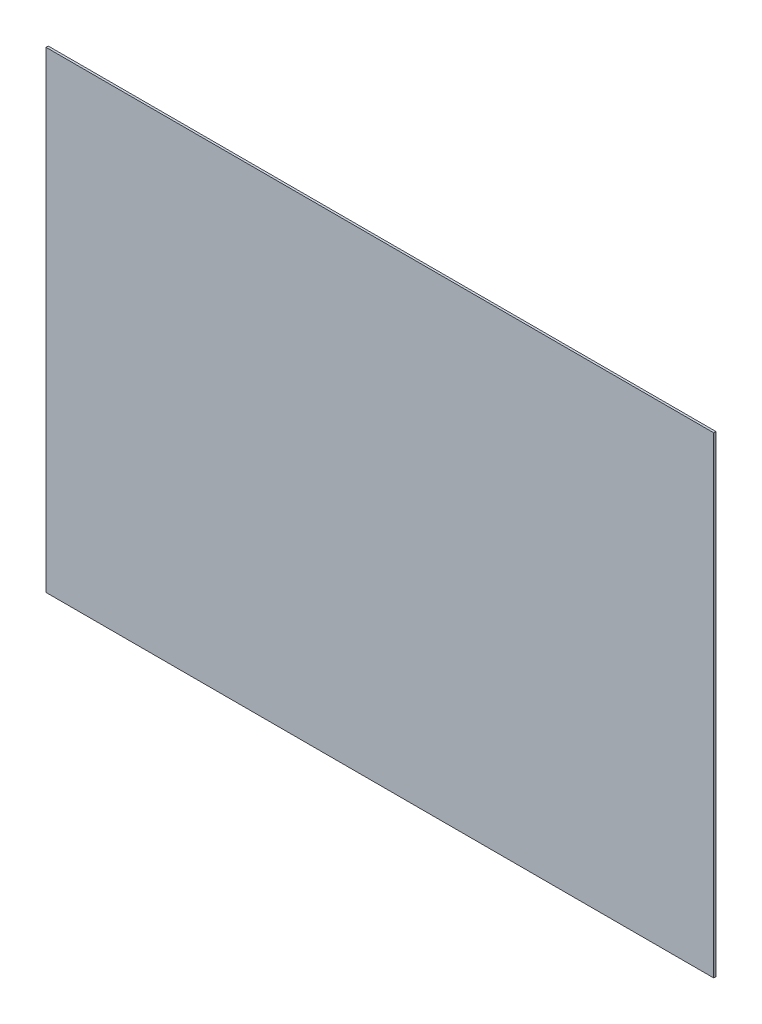
ISO-10303-21;
HEADER;
FILE_DESCRIPTION(('STEP AP214'),'2;1');
FILE_NAME('part.step','',(''),(''),'','','');
FILE_SCHEMA(('AUTOMOTIVE_DESIGN { 1 0 10303 214 1 1 1 1 }'));
ENDSEC;
DATA;
#1=APPLICATION_CONTEXT('core data for automotive mechanical design processes');
#2=APPLICATION_PROTOCOL_DEFINITION('international standard','automotive_design',2000,#1);
#3=PRODUCT_CONTEXT('',#1,'mechanical');
#4=PRODUCT('Part','Part','',(#3));
#5=PRODUCT_RELATED_PRODUCT_CATEGORY('part','',(#4));
#6=PRODUCT_DEFINITION_FORMATION('','',#4);
#7=PRODUCT_DEFINITION_CONTEXT('part definition',#1,'design');
#8=PRODUCT_DEFINITION('design','',#6,#7);
#9=PRODUCT_DEFINITION_SHAPE('','',#8);
#10=(LENGTH_UNIT() NAMED_UNIT(*) SI_UNIT(.MILLI.,.METRE.));
#11=(NAMED_UNIT(*) PLANE_ANGLE_UNIT() SI_UNIT($,.RADIAN.));
#12=(NAMED_UNIT(*) SI_UNIT($,.STERADIAN.) SOLID_ANGLE_UNIT());
#13=UNCERTAINTY_MEASURE_WITH_UNIT(LENGTH_MEASURE(1.E-05),#10,'distance_accuracy_value','');
#14=(GEOMETRIC_REPRESENTATION_CONTEXT(3) GLOBAL_UNCERTAINTY_ASSIGNED_CONTEXT((#13)) GLOBAL_UNIT_ASSIGNED_CONTEXT((#10,
#11,#12)) REPRESENTATION_CONTEXT('',''));
#15=CARTESIAN_POINT('',(0.,0.,0.));
#16=DIRECTION('',(0.,0.,1.));
#17=DIRECTION('',(1.,0.,0.));
#18=AXIS2_PLACEMENT_3D('',#15,#16,#17);
#19=CARTESIAN_POINT('',(-54.0933520941661,28.8189653607095,1.));
#20=DIRECTION('',(1.,0.,0.));
#21=DIRECTION('',(0.,0.,-1.));
#22=AXIS2_PLACEMENT_3D('',#19,#20,#21);
#23=PLANE('',#22);
#24=DIRECTION('',(0.,-1.,0.));
#25=VECTOR('',#24,1.);
#26=CARTESIAN_POINT('',(-54.0933520941661,28.8189653607095,0.));
#27=LINE('',#26,#25);
#28=CARTESIAN_POINT('',(-54.0933520941661,28.8189653607095,0.));
#29=VERTEX_POINT('',#28);
#30=CARTESIAN_POINT('',(-54.0933520941661,-181.18103463929,0.));
#31=VERTEX_POINT('',#30);
#32=EDGE_CURVE('E107',#29,#31,#27,.T.);
#33=ORIENTED_EDGE('',*,*,#32,.T.);
#34=DIRECTION('',(0.,0.,-1.));
#35=VECTOR('',#34,1.);
#36=CARTESIAN_POINT('',(-54.0933520941661,-181.18103463929,1.));
#37=LINE('',#36,#35);
#38=CARTESIAN_POINT('',(-54.0933520941661,-181.18103463929,1.));
#39=VERTEX_POINT('',#38);
#40=EDGE_CURVE('E11',#39,#31,#37,.T.);
#41=ORIENTED_EDGE('',*,*,#40,.F.);
#42=DIRECTION('',(0.,-1.,0.));
#43=VECTOR('',#42,1.);
#44=CARTESIAN_POINT('',(-54.0933520941661,28.8189653607095,1.));
#45=LINE('',#44,#43);
#46=CARTESIAN_POINT('',(-54.0933520941661,28.8189653607095,1.));
#47=VERTEX_POINT('',#46);
#48=EDGE_CURVE('E91',#47,#39,#45,.T.);
#49=ORIENTED_EDGE('',*,*,#48,.F.);
#50=DIRECTION('',(0.,0.,-1.));
#51=VECTOR('',#50,1.);
#52=CARTESIAN_POINT('',(-54.0933520941661,28.8189653607095,1.));
#53=LINE('',#52,#51);
#54=EDGE_CURVE('E103',#47,#29,#53,.T.);
#55=ORIENTED_EDGE('',*,*,#54,.T.);
#56=EDGE_LOOP('',(#33,#41,#49,#55));
#57=FACE_BOUND('',#56,.T.);
#58=ADVANCED_FACE('F39',(#57),#23,.F.);
#59=CARTESIAN_POINT('',(-54.0933520941661,-181.18103463929,1.));
#60=DIRECTION('',(0.,1.,0.));
#61=DIRECTION('',(0.,0.,1.));
#62=AXIS2_PLACEMENT_3D('',#59,#60,#61);
#63=PLANE('',#62);
#64=DIRECTION('',(1.,0.,0.));
#65=VECTOR('',#64,1.);
#66=CARTESIAN_POINT('',(-54.0933520941661,-181.18103463929,0.));
#67=LINE('',#66,#65);
#68=CARTESIAN_POINT('',(242.906647905834,-181.18103463929,0.));
#69=VERTEX_POINT('',#68);
#70=EDGE_CURVE('E96',#31,#69,#67,.T.);
#71=ORIENTED_EDGE('',*,*,#70,.T.);
#72=DIRECTION('',(0.,0.,-1.));
#73=VECTOR('',#72,1.);
#74=CARTESIAN_POINT('',(242.906647905834,-181.18103463929,1.));
#75=LINE('',#74,#73);
#76=CARTESIAN_POINT('',(242.906647905834,-181.18103463929,1.));
#77=VERTEX_POINT('',#76);
#78=EDGE_CURVE('E48',#77,#69,#75,.T.);
#79=ORIENTED_EDGE('',*,*,#78,.F.);
#80=DIRECTION('',(1.,0.,0.));
#81=VECTOR('',#80,1.);
#82=CARTESIAN_POINT('',(-54.0933520941661,-181.18103463929,1.));
#83=LINE('',#82,#81);
#84=EDGE_CURVE('E86',#39,#77,#83,.T.);
#85=ORIENTED_EDGE('',*,*,#84,.F.);
#86=ORIENTED_EDGE('',*,*,#40,.T.);
#87=EDGE_LOOP('',(#71,#79,#85,#86));
#88=FACE_BOUND('',#87,.T.);
#89=ADVANCED_FACE('F95',(#88),#63,.F.);
#90=CARTESIAN_POINT('',(242.906647905834,28.8189653607095,1.));
#91=DIRECTION('',(-1.,0.,0.));
#92=DIRECTION('',(0.,0.,1.));
#93=AXIS2_PLACEMENT_3D('',#90,#91,#92);
#94=PLANE('',#93);
#95=DIRECTION('',(0.,1.,0.));
#96=VECTOR('',#95,1.);
#97=CARTESIAN_POINT('',(242.906647905834,28.8189653607095,0.));
#98=LINE('',#97,#96);
#99=CARTESIAN_POINT('',(242.906647905834,28.8189653607095,0.));
#100=VERTEX_POINT('',#99);
#101=EDGE_CURVE('E73',#69,#100,#98,.T.);
#102=ORIENTED_EDGE('',*,*,#101,.T.);
#103=DIRECTION('',(0.,0.,-1.));
#104=VECTOR('',#103,1.);
#105=CARTESIAN_POINT('',(242.906647905834,28.8189653607095,1.));
#106=LINE('',#105,#104);
#107=CARTESIAN_POINT('',(242.906647905834,28.8189653607095,1.));
#108=VERTEX_POINT('',#107);
#109=EDGE_CURVE('E98',#108,#100,#106,.T.);
#110=ORIENTED_EDGE('',*,*,#109,.F.);
#111=DIRECTION('',(0.,1.,0.));
#112=VECTOR('',#111,1.);
#113=CARTESIAN_POINT('',(242.906647905834,28.8189653607095,1.));
#114=LINE('',#113,#112);
#115=EDGE_CURVE('E89',#77,#108,#114,.T.);
#116=ORIENTED_EDGE('',*,*,#115,.F.);
#117=ORIENTED_EDGE('',*,*,#78,.T.);
#118=EDGE_LOOP('',(#102,#110,#116,#117));
#119=FACE_BOUND('',#118,.T.);
#120=ADVANCED_FACE('F99',(#119),#94,.F.);
#121=CARTESIAN_POINT('',(-54.0933520941661,28.8189653607095,1.));
#122=DIRECTION('',(0.,-1.,0.));
#123=DIRECTION('',(0.,0.,-1.));
#124=AXIS2_PLACEMENT_3D('',#121,#122,#123);
#125=PLANE('',#124);
#126=DIRECTION('',(-1.,0.,0.));
#127=VECTOR('',#126,1.);
#128=CARTESIAN_POINT('',(-54.0933520941661,28.8189653607095,0.));
#129=LINE('',#128,#127);
#130=EDGE_CURVE('E79',#100,#29,#129,.T.);
#131=ORIENTED_EDGE('',*,*,#130,.T.);
#132=ORIENTED_EDGE('',*,*,#54,.F.);
#133=DIRECTION('',(-1.,0.,0.));
#134=VECTOR('',#133,1.);
#135=CARTESIAN_POINT('',(-54.0933520941661,28.8189653607095,1.));
#136=LINE('',#135,#134);
#137=EDGE_CURVE('E56',#108,#47,#136,.T.);
#138=ORIENTED_EDGE('',*,*,#137,.F.);
#139=ORIENTED_EDGE('',*,*,#109,.T.);
#140=EDGE_LOOP('',(#131,#132,#138,#139));
#141=FACE_BOUND('',#140,.T.);
#142=ADVANCED_FACE('F120',(#141),#125,.F.);
#143=CARTESIAN_POINT('',(0.,0.,1.));
#144=DIRECTION('',(0.,0.,1.));
#145=DIRECTION('',(1.,0.,0.));
#146=AXIS2_PLACEMENT_3D('',#143,#144,#145);
#147=PLANE('',#146);
#148=ORIENTED_EDGE('',*,*,#48,.T.);
#149=ORIENTED_EDGE('',*,*,#84,.T.);
#150=ORIENTED_EDGE('',*,*,#115,.T.);
#151=ORIENTED_EDGE('',*,*,#137,.T.);
#152=EDGE_LOOP('',(#148,#149,#150,#151));
#153=FACE_BOUND('',#152,.T.);
#154=ADVANCED_FACE('F87',(#153),#147,.T.);
#155=CARTESIAN_POINT('',(0.,0.,0.));
#156=DIRECTION('',(0.,0.,1.));
#157=DIRECTION('',(1.,0.,0.));
#158=AXIS2_PLACEMENT_3D('',#155,#156,#157);
#159=PLANE('',#158);
#160=ORIENTED_EDGE('',*,*,#32,.F.);
#161=ORIENTED_EDGE('',*,*,#130,.F.);
#162=ORIENTED_EDGE('',*,*,#101,.F.);
#163=ORIENTED_EDGE('',*,*,#70,.F.);
#164=EDGE_LOOP('',(#160,#161,#162,#163));
#165=FACE_BOUND('',#164,.T.);
#166=ADVANCED_FACE('F123',(#165),#159,.F.);
#167=CLOSED_SHELL('',(#58,#89,#120,#142,#154,#166));
#168=MANIFOLD_SOLID_BREP('B2',#167);
#169=ADVANCED_BREP_SHAPE_REPRESENTATION('',(#18,#168),#14);
#170=SHAPE_DEFINITION_REPRESENTATION(#9,#169);
ENDSEC;
END-ISO-10303-21;
